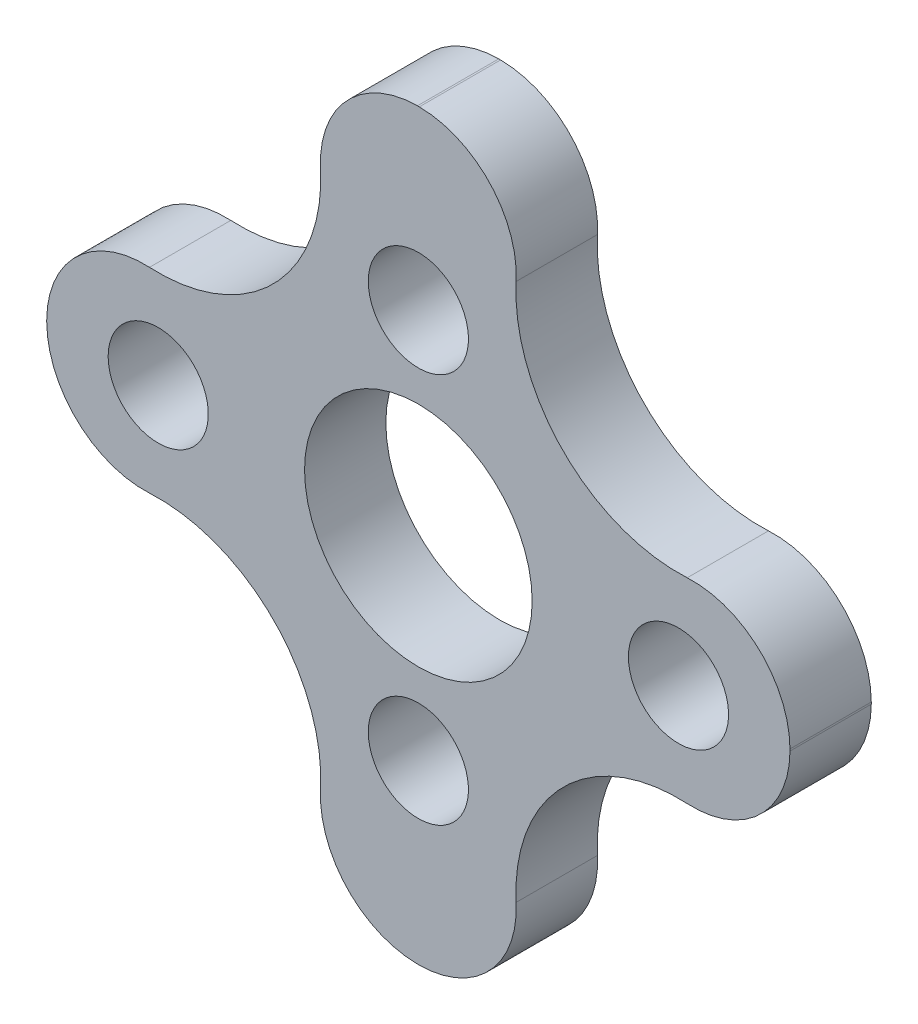
ISO-10303-21;
HEADER;
FILE_DESCRIPTION(('STEP AP214'),'2;1');
FILE_NAME('part.step','',(''),(''),'','','');
FILE_SCHEMA(('AUTOMOTIVE_DESIGN { 1 0 10303 214 1 1 1 1 }'));
ENDSEC;
DATA;
#1=APPLICATION_CONTEXT('core data for automotive mechanical design processes');
#2=APPLICATION_PROTOCOL_DEFINITION('international standard','automotive_design',2000,#1);
#3=PRODUCT_CONTEXT('',#1,'mechanical');
#4=PRODUCT('Part','Part','',(#3));
#5=PRODUCT_RELATED_PRODUCT_CATEGORY('part','',(#4));
#6=PRODUCT_DEFINITION_FORMATION('','',#4);
#7=PRODUCT_DEFINITION_CONTEXT('part definition',#1,'design');
#8=PRODUCT_DEFINITION('design','',#6,#7);
#9=PRODUCT_DEFINITION_SHAPE('','',#8);
#10=(LENGTH_UNIT() NAMED_UNIT(*) SI_UNIT(.MILLI.,.METRE.));
#11=(NAMED_UNIT(*) PLANE_ANGLE_UNIT() SI_UNIT($,.RADIAN.));
#12=(NAMED_UNIT(*) SI_UNIT($,.STERADIAN.) SOLID_ANGLE_UNIT());
#13=UNCERTAINTY_MEASURE_WITH_UNIT(LENGTH_MEASURE(1.E-05),#10,'distance_accuracy_value','');
#14=(GEOMETRIC_REPRESENTATION_CONTEXT(3) GLOBAL_UNCERTAINTY_ASSIGNED_CONTEXT((#13)) GLOBAL_UNIT_ASSIGNED_CONTEXT((#10,
#11,#12)) REPRESENTATION_CONTEXT('',''));
#15=CARTESIAN_POINT('',(0.,0.,0.));
#16=DIRECTION('',(0.,0.,1.));
#17=DIRECTION('',(1.,0.,0.));
#18=AXIS2_PLACEMENT_3D('',#15,#16,#17);
#19=CARTESIAN_POINT('',(8.42889909415681,0.0115054254860081,2.5));
#20=DIRECTION('',(0.,0.,1.));
#21=DIRECTION('',(1.,0.,0.));
#22=AXIS2_PLACEMENT_3D('',#19,#20,#21);
#23=CYLINDRICAL_SURFACE('',#22,3.);
#24=DIRECTION('',(0.,0.,-1.));
#25=VECTOR('',#24,1.);
#26=CARTESIAN_POINT('',(8.26806193384802,3.00719089092857,2.5));
#27=LINE('',#26,#25);
#28=CARTESIAN_POINT('',(8.26806193384801,3.00719089092857,2.5));
#29=VERTEX_POINT('',#28);
#30=CARTESIAN_POINT('',(8.26806193384801,3.00719089092857,0.));
#31=VERTEX_POINT('',#30);
#32=EDGE_CURVE('E272',#29,#31,#27,.T.);
#33=ORIENTED_EDGE('',*,*,#32,.F.);
#34=CARTESIAN_POINT('',(8.42889909415681,0.0115054254860081,2.5));
#35=DIRECTION('',(0.,0.,-1.));
#36=DIRECTION('',(-1.,0.,0.));
#37=AXIS2_PLACEMENT_3D('',#34,#35,#36);
#38=CIRCLE('',#37,3.);
#39=CARTESIAN_POINT('',(11.4288494531903,0.0287635637148508,2.5));
#40=VERTEX_POINT('',#39);
#41=EDGE_CURVE('E46',#40,#29,#38,.F.);
#42=ORIENTED_EDGE('',*,*,#41,.F.);
#43=DIRECTION('',(0.,0.,1.));
#44=VECTOR('',#43,1.);
#45=CARTESIAN_POINT('',(11.4288494531903,0.0287635637148472,2.5));
#46=LINE('',#45,#44);
#47=CARTESIAN_POINT('',(11.4288494531903,0.0287635637148508,0.));
#48=VERTEX_POINT('',#47);
#49=EDGE_CURVE('E276',#48,#40,#46,.T.);
#50=ORIENTED_EDGE('',*,*,#49,.F.);
#51=CARTESIAN_POINT('',(8.42889909415681,0.0115054254860081,0.));
#52=DIRECTION('',(0.,0.,-1.));
#53=DIRECTION('',(-1.,0.,0.));
#54=AXIS2_PLACEMENT_3D('',#51,#52,#53);
#55=CIRCLE('',#54,3.);
#56=EDGE_CURVE('E11',#31,#48,#55,.T.);
#57=ORIENTED_EDGE('',*,*,#56,.F.);
#58=EDGE_LOOP('',(#33,#42,#50,#57));
#59=FACE_BOUND('',#58,.T.);
#60=ADVANCED_FACE('F38',(#59),#23,.T.);
#61=CARTESIAN_POINT('',(8.42889909415681,-0.0115054254865624,2.5));
#62=DIRECTION('',(0.,0.,1.));
#63=DIRECTION('',(1.,0.,0.));
#64=AXIS2_PLACEMENT_3D('',#61,#62,#63);
#65=CYLINDRICAL_SURFACE('',#64,3.);
#66=DIRECTION('',(0.,0.,1.));
#67=VECTOR('',#66,1.);
#68=CARTESIAN_POINT('',(11.4288494531902,-0.028763563716579,2.5));
#69=LINE('',#68,#67);
#70=CARTESIAN_POINT('',(11.4288494531902,-0.0287635637165706,2.5));
#71=VERTEX_POINT('',#70);
#72=CARTESIAN_POINT('',(11.4288494531902,-0.0287635637165773,0.));
#73=VERTEX_POINT('',#72);
#74=EDGE_CURVE('E260',#71,#73,#69,.F.);
#75=ORIENTED_EDGE('',*,*,#74,.F.);
#76=CARTESIAN_POINT('',(8.42889909415681,-0.0115054254865624,2.5));
#77=DIRECTION('',(0.,0.,-1.));
#78=DIRECTION('',(-1.,0.,0.));
#79=AXIS2_PLACEMENT_3D('',#76,#77,#78);
#80=CIRCLE('',#79,3.);
#81=CARTESIAN_POINT('',(8.26806193384793,-3.00719089092912,2.5));
#82=VERTEX_POINT('',#81);
#83=EDGE_CURVE('E267',#82,#71,#80,.F.);
#84=ORIENTED_EDGE('',*,*,#83,.F.);
#85=DIRECTION('',(0.,0.,-1.));
#86=VECTOR('',#85,1.);
#87=CARTESIAN_POINT('',(8.26806193384792,-3.00719089092911,2.5));
#88=LINE('',#87,#86);
#89=CARTESIAN_POINT('',(8.26806193384793,-3.00719089092912,0.));
#90=VERTEX_POINT('',#89);
#91=EDGE_CURVE('E264',#90,#82,#88,.F.);
#92=ORIENTED_EDGE('',*,*,#91,.F.);
#93=CARTESIAN_POINT('',(8.42889909415681,-0.0115054254865624,0.));
#94=DIRECTION('',(0.,0.,-1.));
#95=DIRECTION('',(-1.,0.,0.));
#96=AXIS2_PLACEMENT_3D('',#93,#94,#95);
#97=CIRCLE('',#96,3.);
#98=EDGE_CURVE('E175',#73,#90,#97,.T.);
#99=ORIENTED_EDGE('',*,*,#98,.F.);
#100=EDGE_LOOP('',(#75,#84,#92,#99));
#101=FACE_BOUND('',#100,.T.);
#102=ADVANCED_FACE('F419',(#101),#65,.T.);
#103=CARTESIAN_POINT('',(-8.42889909415682,0.011505425486511,2.5));
#104=DIRECTION('',(0.,0.,-1.));
#105=DIRECTION('',(-1.,0.,0.));
#106=AXIS2_PLACEMENT_3D('',#103,#104,#105);
#107=CYLINDRICAL_SURFACE('',#106,3.);
#108=DIRECTION('',(0.,0.,-1.));
#109=VECTOR('',#108,1.);
#110=CARTESIAN_POINT('',(-8.26806193384802,3.00719089092907,2.5));
#111=LINE('',#110,#109);
#112=CARTESIAN_POINT('',(-8.26806193384802,3.00719089092907,0.));
#113=VERTEX_POINT('',#112);
#114=CARTESIAN_POINT('',(-8.26806193384802,3.00719089092907,2.5));
#115=VERTEX_POINT('',#114);
#116=EDGE_CURVE('E246',#113,#115,#111,.F.);
#117=ORIENTED_EDGE('',*,*,#116,.F.);
#118=CARTESIAN_POINT('',(-8.42889909415682,0.011505425486511,0.));
#119=DIRECTION('',(0.,0.,-1.));
#120=DIRECTION('',(-1.,0.,0.));
#121=AXIS2_PLACEMENT_3D('',#118,#119,#120);
#122=CIRCLE('',#121,3.);
#123=CARTESIAN_POINT('',(-11.4288494531903,0.0287635637162861,0.));
#124=VERTEX_POINT('',#123);
#125=EDGE_CURVE('E254',#124,#113,#122,.T.);
#126=ORIENTED_EDGE('',*,*,#125,.F.);
#127=DIRECTION('',(0.,0.,-1.));
#128=VECTOR('',#127,1.);
#129=CARTESIAN_POINT('',(-11.4288494531903,0.0287635637162854,2.5));
#130=LINE('',#129,#128);
#131=CARTESIAN_POINT('',(-11.4288494531903,0.0287635637099313,2.5));
#132=VERTEX_POINT('',#131);
#133=EDGE_CURVE('E250',#132,#124,#130,.T.);
#134=ORIENTED_EDGE('',*,*,#133,.F.);
#135=CARTESIAN_POINT('',(-8.42889909415682,0.011505425486511,2.5));
#136=DIRECTION('',(0.,0.,-1.));
#137=DIRECTION('',(-1.,0.,0.));
#138=AXIS2_PLACEMENT_3D('',#135,#136,#137);
#139=CIRCLE('',#138,3.);
#140=EDGE_CURVE('E257',#115,#132,#139,.F.);
#141=ORIENTED_EDGE('',*,*,#140,.F.);
#142=EDGE_LOOP('',(#117,#126,#134,#141));
#143=FACE_BOUND('',#142,.T.);
#144=ADVANCED_FACE('F406',(#143),#107,.T.);
#145=CARTESIAN_POINT('',(-0.0115054254865123,8.42889909415687,2.5));
#146=DIRECTION('',(0.,0.,1.));
#147=DIRECTION('',(1.,0.,0.));
#148=AXIS2_PLACEMENT_3D('',#145,#146,#147);
#149=CYLINDRICAL_SURFACE('',#148,3.);
#150=DIRECTION('',(0.,0.,-1.));
#151=VECTOR('',#150,1.);
#152=CARTESIAN_POINT('',(-3.00719089092907,8.26806193384804,2.5));
#153=LINE('',#152,#151);
#154=CARTESIAN_POINT('',(-3.00719089092907,8.26806193384804,2.5));
#155=VERTEX_POINT('',#154);
#156=CARTESIAN_POINT('',(-3.00719089092907,8.26806193384804,0.));
#157=VERTEX_POINT('',#156);
#158=EDGE_CURVE('E232',#155,#157,#153,.T.);
#159=ORIENTED_EDGE('',*,*,#158,.F.);
#160=CARTESIAN_POINT('',(-0.0115054254865123,8.42889909415687,2.5));
#161=DIRECTION('',(0.,0.,-1.));
#162=DIRECTION('',(-1.,0.,0.));
#163=AXIS2_PLACEMENT_3D('',#160,#161,#162);
#164=CIRCLE('',#163,3.);
#165=CARTESIAN_POINT('',(-0.0287635637163597,11.4288494531903,2.5));
#166=VERTEX_POINT('',#165);
#167=EDGE_CURVE('E240',#166,#155,#164,.F.);
#168=ORIENTED_EDGE('',*,*,#167,.F.);
#169=DIRECTION('',(0.,0.,1.));
#170=VECTOR('',#169,1.);
#171=CARTESIAN_POINT('',(-0.02876356371636,11.4288494531903,2.5));
#172=LINE('',#171,#170);
#173=CARTESIAN_POINT('',(-0.0287635637163597,11.4288494531903,0.));
#174=VERTEX_POINT('',#173);
#175=EDGE_CURVE('E236',#174,#166,#172,.T.);
#176=ORIENTED_EDGE('',*,*,#175,.F.);
#177=CARTESIAN_POINT('',(-0.0115054254865123,8.42889909415687,0.));
#178=DIRECTION('',(0.,0.,-1.));
#179=DIRECTION('',(-1.,0.,0.));
#180=AXIS2_PLACEMENT_3D('',#177,#178,#179);
#181=CIRCLE('',#180,3.);
#182=EDGE_CURVE('E243',#157,#174,#181,.T.);
#183=ORIENTED_EDGE('',*,*,#182,.F.);
#184=EDGE_LOOP('',(#159,#168,#176,#183));
#185=FACE_BOUND('',#184,.T.);
#186=ADVANCED_FACE('F369',(#185),#149,.T.);
#187=CARTESIAN_POINT('',(0.0115054254862531,8.42889909415687,2.5));
#188=DIRECTION('',(0.,0.,1.));
#189=DIRECTION('',(1.,0.,0.));
#190=AXIS2_PLACEMENT_3D('',#187,#188,#189);
#191=CYLINDRICAL_SURFACE('',#190,3.);
#192=DIRECTION('',(0.,0.,1.));
#193=VECTOR('',#192,1.);
#194=CARTESIAN_POINT('',(0.0287635637155534,11.4288494531903,2.5));
#195=LINE('',#194,#193);
#196=CARTESIAN_POINT('',(0.028763563715549,11.4288494531903,2.5));
#197=VERTEX_POINT('',#196);
#198=CARTESIAN_POINT('',(0.028763563715549,11.4288494531903,0.));
#199=VERTEX_POINT('',#198);
#200=EDGE_CURVE('E217',#197,#199,#195,.F.);
#201=ORIENTED_EDGE('',*,*,#200,.F.);
#202=CARTESIAN_POINT('',(0.0115054254862531,8.42889909415687,2.5));
#203=DIRECTION('',(0.,0.,-1.));
#204=DIRECTION('',(-1.,0.,0.));
#205=AXIS2_PLACEMENT_3D('',#202,#203,#204);
#206=CIRCLE('',#205,3.);
#207=CARTESIAN_POINT('',(3.00719089092881,8.26806193384797,2.5));
#208=VERTEX_POINT('',#207);
#209=EDGE_CURVE('E225',#208,#197,#206,.F.);
#210=ORIENTED_EDGE('',*,*,#209,.F.);
#211=DIRECTION('',(0.,0.,-1.));
#212=VECTOR('',#211,1.);
#213=CARTESIAN_POINT('',(3.00719089092881,8.26806193384796,2.5));
#214=LINE('',#213,#212);
#215=CARTESIAN_POINT('',(3.00719089092881,8.26806193384797,0.));
#216=VERTEX_POINT('',#215);
#217=EDGE_CURVE('E221',#216,#208,#214,.F.);
#218=ORIENTED_EDGE('',*,*,#217,.F.);
#219=CARTESIAN_POINT('',(0.0115054254862531,8.42889909415687,0.));
#220=DIRECTION('',(0.,0.,-1.));
#221=DIRECTION('',(-1.,0.,0.));
#222=AXIS2_PLACEMENT_3D('',#219,#220,#221);
#223=CIRCLE('',#222,3.);
#224=EDGE_CURVE('E228',#199,#216,#223,.T.);
#225=ORIENTED_EDGE('',*,*,#224,.F.);
#226=EDGE_LOOP('',(#201,#210,#218,#225));
#227=FACE_BOUND('',#226,.T.);
#228=ADVANCED_FACE('F409',(#227),#191,.T.);
#229=CARTESIAN_POINT('',(-8.42889909415682,-0.0115054254865408,2.5));
#230=DIRECTION('',(0.,0.,1.));
#231=DIRECTION('',(1.,0.,0.));
#232=AXIS2_PLACEMENT_3D('',#229,#230,#231);
#233=CYLINDRICAL_SURFACE('',#232,3.);
#234=DIRECTION('',(0.,0.,-1.));
#235=VECTOR('',#234,1.);
#236=CARTESIAN_POINT('',(-8.26806193384801,-3.0071908909291,2.5));
#237=LINE('',#236,#235);
#238=CARTESIAN_POINT('',(-8.268061933848,-3.0071908909291,2.5));
#239=VERTEX_POINT('',#238);
#240=CARTESIAN_POINT('',(-8.268061933848,-3.0071908909291,0.));
#241=VERTEX_POINT('',#240);
#242=EDGE_CURVE('E203',#239,#241,#237,.T.);
#243=ORIENTED_EDGE('',*,*,#242,.F.);
#244=CARTESIAN_POINT('',(-8.42889909415682,-0.0115054254865408,2.5));
#245=DIRECTION('',(0.,0.,-1.));
#246=DIRECTION('',(-1.,0.,0.));
#247=AXIS2_PLACEMENT_3D('',#244,#245,#246);
#248=CIRCLE('',#247,3.);
#249=CARTESIAN_POINT('',(-11.4288494531903,-0.0287635637163422,2.5));
#250=VERTEX_POINT('',#249);
#251=EDGE_CURVE('E211',#250,#239,#248,.F.);
#252=ORIENTED_EDGE('',*,*,#251,.F.);
#253=DIRECTION('',(0.,0.,-1.));
#254=VECTOR('',#253,1.);
#255=CARTESIAN_POINT('',(-11.4288494531903,-0.0287635637163441,2.5));
#256=LINE('',#255,#254);
#257=CARTESIAN_POINT('',(-11.4288494531903,-0.0287635637163422,0.));
#258=VERTEX_POINT('',#257);
#259=EDGE_CURVE('E207',#258,#250,#256,.F.);
#260=ORIENTED_EDGE('',*,*,#259,.F.);
#261=CARTESIAN_POINT('',(-8.42889909415682,-0.0115054254865408,0.));
#262=DIRECTION('',(0.,0.,-1.));
#263=DIRECTION('',(-1.,0.,0.));
#264=AXIS2_PLACEMENT_3D('',#261,#262,#263);
#265=CIRCLE('',#264,3.);
#266=EDGE_CURVE('E214',#241,#258,#265,.T.);
#267=ORIENTED_EDGE('',*,*,#266,.F.);
#268=EDGE_LOOP('',(#243,#252,#260,#267));
#269=FACE_BOUND('',#268,.T.);
#270=ADVANCED_FACE('F400',(#269),#233,.T.);
#271=CARTESIAN_POINT('',(-0.0115054254864763,-8.42889909415676,2.5));
#272=DIRECTION('',(0.,0.,-1.));
#273=DIRECTION('',(-1.,0.,0.));
#274=AXIS2_PLACEMENT_3D('',#271,#272,#273);
#275=CYLINDRICAL_SURFACE('',#274,3.);
#276=DIRECTION('',(0.,0.,-1.));
#277=VECTOR('',#276,1.);
#278=CARTESIAN_POINT('',(-3.00719089092904,-8.26806193384798,2.5));
#279=LINE('',#278,#277);
#280=CARTESIAN_POINT('',(-3.00719089092904,-8.26806193384799,0.));
#281=VERTEX_POINT('',#280);
#282=CARTESIAN_POINT('',(-3.00719089092904,-8.26806193384799,2.5));
#283=VERTEX_POINT('',#282);
#284=EDGE_CURVE('E160',#281,#283,#279,.F.);
#285=ORIENTED_EDGE('',*,*,#284,.F.);
#286=CARTESIAN_POINT('',(-0.0115054254864763,-8.42889909415676,0.));
#287=DIRECTION('',(0.,0.,-1.));
#288=DIRECTION('',(-1.,0.,0.));
#289=AXIS2_PLACEMENT_3D('',#286,#287,#288);
#290=CIRCLE('',#289,3.);
#291=CARTESIAN_POINT('',(-0.0287635637160889,-11.4288494531902,0.));
#292=VERTEX_POINT('',#291);
#293=EDGE_CURVE('E196',#292,#281,#290,.T.);
#294=ORIENTED_EDGE('',*,*,#293,.F.);
#295=DIRECTION('',(0.,0.,1.));
#296=VECTOR('',#295,1.);
#297=CARTESIAN_POINT('',(-0.0287635637160868,-11.4288494531902,2.5));
#298=LINE('',#297,#296);
#299=CARTESIAN_POINT('',(-0.0287635637097385,-11.4288494531902,2.5));
#300=VERTEX_POINT('',#299);
#301=EDGE_CURVE('E192',#300,#292,#298,.F.);
#302=ORIENTED_EDGE('',*,*,#301,.F.);
#303=CARTESIAN_POINT('',(-0.0115054254864763,-8.42889909415676,2.5));
#304=DIRECTION('',(0.,0.,-1.));
#305=DIRECTION('',(-1.,0.,0.));
#306=AXIS2_PLACEMENT_3D('',#303,#304,#305);
#307=CIRCLE('',#306,3.);
#308=EDGE_CURVE('E200',#283,#300,#307,.F.);
#309=ORIENTED_EDGE('',*,*,#308,.F.);
#310=EDGE_LOOP('',(#285,#294,#302,#309));
#311=FACE_BOUND('',#310,.T.);
#312=ADVANCED_FACE('F394',(#311),#275,.T.);
#313=CARTESIAN_POINT('',(0.0115054254860793,-8.42889909415676,2.5));
#314=DIRECTION('',(0.,0.,1.));
#315=DIRECTION('',(1.,0.,0.));
#316=AXIS2_PLACEMENT_3D('',#313,#314,#315);
#317=CYLINDRICAL_SURFACE('',#316,3.);
#318=DIRECTION('',(0.,0.,-1.));
#319=VECTOR('',#318,1.);
#320=CARTESIAN_POINT('',(3.00719089092864,-8.26806193384807,2.5));
#321=LINE('',#320,#319);
#322=CARTESIAN_POINT('',(3.00719089092864,-8.26806193384806,2.5));
#323=VERTEX_POINT('',#322);
#324=CARTESIAN_POINT('',(3.00719089092864,-8.26806193384806,0.));
#325=VERTEX_POINT('',#324);
#326=EDGE_CURVE('E152',#323,#325,#321,.T.);
#327=ORIENTED_EDGE('',*,*,#326,.F.);
#328=CARTESIAN_POINT('',(0.0115054254860793,-8.42889909415676,2.5));
#329=DIRECTION('',(0.,0.,-1.));
#330=DIRECTION('',(-1.,0.,0.));
#331=AXIS2_PLACEMENT_3D('',#328,#329,#330);
#332=CIRCLE('',#331,3.);
#333=CARTESIAN_POINT('',(0.0287635637153036,-11.4288494531902,2.5));
#334=VERTEX_POINT('',#333);
#335=EDGE_CURVE('E161',#334,#323,#332,.F.);
#336=ORIENTED_EDGE('',*,*,#335,.F.);
#337=DIRECTION('',(0.,0.,1.));
#338=VECTOR('',#337,1.);
#339=CARTESIAN_POINT('',(0.0287635637153023,-11.4288494531902,2.5));
#340=LINE('',#339,#338);
#341=CARTESIAN_POINT('',(0.0287635637153036,-11.4288494531902,0.));
#342=VERTEX_POINT('',#341);
#343=EDGE_CURVE('E155',#342,#334,#340,.T.);
#344=ORIENTED_EDGE('',*,*,#343,.F.);
#345=CARTESIAN_POINT('',(0.0115054254860793,-8.42889909415676,0.));
#346=DIRECTION('',(0.,0.,-1.));
#347=DIRECTION('',(-1.,0.,0.));
#348=AXIS2_PLACEMENT_3D('',#345,#346,#347);
#349=CIRCLE('',#348,3.);
#350=EDGE_CURVE('E148',#325,#342,#349,.T.);
#351=ORIENTED_EDGE('',*,*,#350,.F.);
#352=EDGE_LOOP('',(#327,#336,#344,#351));
#353=FACE_BOUND('',#352,.T.);
#354=ADVANCED_FACE('F150',(#353),#317,.T.);
#355=CARTESIAN_POINT('',(0.,6.42893218813458,2.5));
#356=DIRECTION('',(0.,0.,1.));
#357=DIRECTION('',(1.,0.,0.));
#358=AXIS2_PLACEMENT_3D('',#355,#356,#357);
#359=CYLINDRICAL_SURFACE('',#358,5.);
#360=CARTESIAN_POINT('',(0.,6.42893218813458,0.));
#361=DIRECTION('',(0.,0.,-1.));
#362=DIRECTION('',(-1.,0.,0.));
#363=AXIS2_PLACEMENT_3D('',#360,#361,#362);
#364=CIRCLE('',#363,5.);
#365=EDGE_CURVE('E356',#174,#199,#364,.T.);
#366=ORIENTED_EDGE('',*,*,#365,.F.);
#367=ORIENTED_EDGE('',*,*,#175,.T.);
#368=CARTESIAN_POINT('',(0.,6.42893218813458,2.5));
#369=DIRECTION('',(0.,0.,-1.));
#370=DIRECTION('',(-1.,0.,0.));
#371=AXIS2_PLACEMENT_3D('',#368,#369,#370);
#372=CIRCLE('',#371,5.);
#373=EDGE_CURVE('E181',#197,#166,#372,.F.);
#374=ORIENTED_EDGE('',*,*,#373,.F.);
#375=ORIENTED_EDGE('',*,*,#200,.T.);
#376=EDGE_LOOP('',(#366,#367,#374,#375));
#377=FACE_BOUND('',#376,.T.);
#378=ADVANCED_FACE('F366',(#377),#359,.T.);
#379=CARTESIAN_POINT('',(-6.42893218813453,0.,2.5));
#380=DIRECTION('',(0.,0.,-1.));
#381=DIRECTION('',(-1.,0.,0.));
#382=AXIS2_PLACEMENT_3D('',#379,#380,#381);
#383=CYLINDRICAL_SURFACE('',#382,5.);
#384=CARTESIAN_POINT('',(-6.42893218813453,0.,2.5));
#385=DIRECTION('',(0.,0.,-1.));
#386=DIRECTION('',(-1.,0.,0.));
#387=AXIS2_PLACEMENT_3D('',#384,#385,#386);
#388=CIRCLE('',#387,5.);
#389=EDGE_CURVE('E349',#132,#250,#388,.F.);
#390=ORIENTED_EDGE('',*,*,#389,.F.);
#391=ORIENTED_EDGE('',*,*,#133,.T.);
#392=CARTESIAN_POINT('',(-6.42893218813453,0.,0.));
#393=DIRECTION('',(0.,0.,-1.));
#394=DIRECTION('',(-1.,0.,0.));
#395=AXIS2_PLACEMENT_3D('',#392,#393,#394);
#396=CIRCLE('',#395,5.);
#397=EDGE_CURVE('E352',#258,#124,#396,.T.);
#398=ORIENTED_EDGE('',*,*,#397,.F.);
#399=ORIENTED_EDGE('',*,*,#259,.T.);
#400=EDGE_LOOP('',(#390,#391,#398,#399));
#401=FACE_BOUND('',#400,.T.);
#402=ADVANCED_FACE('F403',(#401),#383,.T.);
#403=CARTESIAN_POINT('',(0.,-6.42893218813447,2.5));
#404=DIRECTION('',(0.,0.,1.));
#405=DIRECTION('',(1.,0.,0.));
#406=AXIS2_PLACEMENT_3D('',#403,#404,#405);
#407=CYLINDRICAL_SURFACE('',#406,5.);
#408=CARTESIAN_POINT('',(0.,-6.42893218813447,2.5));
#409=DIRECTION('',(0.,0.,-1.));
#410=DIRECTION('',(-1.,0.,0.));
#411=AXIS2_PLACEMENT_3D('',#408,#409,#410);
#412=CIRCLE('',#411,5.);
#413=EDGE_CURVE('E346',#300,#334,#412,.F.);
#414=ORIENTED_EDGE('',*,*,#413,.F.);
#415=ORIENTED_EDGE('',*,*,#301,.T.);
#416=CARTESIAN_POINT('',(0.,-6.42893218813447,0.));
#417=DIRECTION('',(0.,0.,-1.));
#418=DIRECTION('',(-1.,0.,0.));
#419=AXIS2_PLACEMENT_3D('',#416,#417,#418);
#420=CIRCLE('',#419,5.);
#421=EDGE_CURVE('E343',#342,#292,#420,.T.);
#422=ORIENTED_EDGE('',*,*,#421,.F.);
#423=ORIENTED_EDGE('',*,*,#343,.T.);
#424=EDGE_LOOP('',(#414,#415,#422,#423));
#425=FACE_BOUND('',#424,.T.);
#426=ADVANCED_FACE('F434',(#425),#407,.T.);
#427=CARTESIAN_POINT('',(6.42893218813452,1.15359111152458E-13,2.5));
#428=DIRECTION('',(0.,0.,1.));
#429=DIRECTION('',(1.,0.,0.));
#430=AXIS2_PLACEMENT_3D('',#427,#428,#429);
#431=CYLINDRICAL_SURFACE('',#430,5.);
#432=CARTESIAN_POINT('',(6.42893218813452,1.15359111152458E-13,0.));
#433=DIRECTION('',(0.,0.,-1.));
#434=DIRECTION('',(-1.,0.,0.));
#435=AXIS2_PLACEMENT_3D('',#432,#433,#434);
#436=CIRCLE('',#435,5.);
#437=EDGE_CURVE('E335',#48,#73,#436,.T.);
#438=ORIENTED_EDGE('',*,*,#437,.F.);
#439=ORIENTED_EDGE('',*,*,#49,.T.);
#440=CARTESIAN_POINT('',(6.42893218813452,1.15359111152458E-13,2.5));
#441=DIRECTION('',(0.,0.,-1.));
#442=DIRECTION('',(-1.,0.,0.));
#443=AXIS2_PLACEMENT_3D('',#440,#441,#442);
#444=CIRCLE('',#443,5.);
#445=EDGE_CURVE('E286',#71,#40,#444,.F.);
#446=ORIENTED_EDGE('',*,*,#445,.F.);
#447=ORIENTED_EDGE('',*,*,#74,.T.);
#448=EDGE_LOOP('',(#438,#439,#446,#447));
#449=FACE_BOUND('',#448,.T.);
#450=ADVANCED_FACE('F432',(#449),#431,.T.);
#451=CARTESIAN_POINT('',(0.,0.,2.5));
#452=DIRECTION('',(0.,0.,-1.));
#453=DIRECTION('',(-1.,0.,0.));
#454=AXIS2_PLACEMENT_3D('',#451,#452,#453);
#455=PLANE('',#454);
#456=CARTESIAN_POINT('',(8.,0.,2.5));
#457=DIRECTION('',(0.,0.,-1.));
#458=DIRECTION('',(-1.,0.,0.));
#459=AXIS2_PLACEMENT_3D('',#456,#457,#458);
#460=CIRCLE('',#459,1.54);
#461=CARTESIAN_POINT('',(6.46,0.,2.5));
#462=VERTEX_POINT('',#461);
#463=EDGE_CURVE('E306',#462,#462,#460,.T.);
#464=ORIENTED_EDGE('',*,*,#463,.T.);
#465=EDGE_LOOP('',(#464));
#466=FACE_BOUND('',#465,.T.);
#467=CARTESIAN_POINT('',(-8.,0.,2.5));
#468=DIRECTION('',(0.,0.,-1.));
#469=DIRECTION('',(-1.,0.,0.));
#470=AXIS2_PLACEMENT_3D('',#467,#468,#469);
#471=CIRCLE('',#470,1.54);
#472=CARTESIAN_POINT('',(-9.54,0.,2.5));
#473=VERTEX_POINT('',#472);
#474=EDGE_CURVE('E297',#473,#473,#471,.T.);
#475=ORIENTED_EDGE('',*,*,#474,.T.);
#476=EDGE_LOOP('',(#475));
#477=FACE_BOUND('',#476,.T.);
#478=CARTESIAN_POINT('',(0.,6.,2.5));
#479=DIRECTION('',(0.,0.,-1.));
#480=DIRECTION('',(-1.,0.,0.));
#481=AXIS2_PLACEMENT_3D('',#478,#479,#480);
#482=CIRCLE('',#481,1.54);
#483=CARTESIAN_POINT('',(-1.54,6.,2.5));
#484=VERTEX_POINT('',#483);
#485=EDGE_CURVE('E324',#484,#484,#482,.T.);
#486=ORIENTED_EDGE('',*,*,#485,.T.);
#487=EDGE_LOOP('',(#486));
#488=FACE_BOUND('',#487,.T.);
#489=CARTESIAN_POINT('',(0.,-6.,2.5));
#490=DIRECTION('',(0.,0.,-1.));
#491=DIRECTION('',(-1.,0.,0.));
#492=AXIS2_PLACEMENT_3D('',#489,#490,#491);
#493=CIRCLE('',#492,1.54);
#494=CARTESIAN_POINT('',(-1.54,-6.,2.5));
#495=VERTEX_POINT('',#494);
#496=EDGE_CURVE('E315',#495,#495,#493,.T.);
#497=ORIENTED_EDGE('',*,*,#496,.T.);
#498=EDGE_LOOP('',(#497));
#499=FACE_BOUND('',#498,.T.);
#500=CARTESIAN_POINT('',(0.,0.,2.5));
#501=DIRECTION('',(0.,0.,-1.));
#502=DIRECTION('',(-1.,0.,0.));
#503=AXIS2_PLACEMENT_3D('',#500,#501,#502);
#504=CIRCLE('',#503,3.5);
#505=CARTESIAN_POINT('',(-3.5,0.,2.5));
#506=VERTEX_POINT('',#505);
#507=EDGE_CURVE('E331',#506,#506,#504,.T.);
#508=ORIENTED_EDGE('',*,*,#507,.T.);
#509=EDGE_LOOP('',(#508));
#510=FACE_BOUND('',#509,.T.);
#511=ORIENTED_EDGE('',*,*,#445,.T.);
#512=ORIENTED_EDGE('',*,*,#41,.T.);
#513=CARTESIAN_POINT('',(8.,7.99999999999977,2.5));
#514=DIRECTION('',(0.,0.,-1.));
#515=DIRECTION('',(-1.,0.,0.));
#516=AXIS2_PLACEMENT_3D('',#513,#514,#515);
#517=CIRCLE('',#516,5.00000000000027);
#518=EDGE_CURVE('E283',#29,#208,#517,.T.);
#519=ORIENTED_EDGE('',*,*,#518,.T.);
#520=ORIENTED_EDGE('',*,*,#209,.T.);
#521=ORIENTED_EDGE('',*,*,#373,.T.);
#522=ORIENTED_EDGE('',*,*,#167,.T.);
#523=CARTESIAN_POINT('',(-8.,8.,2.5));
#524=DIRECTION('',(0.,0.,-1.));
#525=DIRECTION('',(-1.,0.,0.));
#526=AXIS2_PLACEMENT_3D('',#523,#524,#525);
#527=CIRCLE('',#526,5.);
#528=EDGE_CURVE('E314',#155,#115,#527,.T.);
#529=ORIENTED_EDGE('',*,*,#528,.T.);
#530=ORIENTED_EDGE('',*,*,#140,.T.);
#531=ORIENTED_EDGE('',*,*,#389,.T.);
#532=ORIENTED_EDGE('',*,*,#251,.T.);
#533=CARTESIAN_POINT('',(-7.99999999999997,-8.00000000000003,2.5));
#534=DIRECTION('',(0.,0.,-1.));
#535=DIRECTION('',(-1.,0.,0.));
#536=AXIS2_PLACEMENT_3D('',#533,#534,#535);
#537=CIRCLE('',#536,5.);
#538=EDGE_CURVE('E380',#239,#283,#537,.T.);
#539=ORIENTED_EDGE('',*,*,#538,.T.);
#540=ORIENTED_EDGE('',*,*,#308,.T.);
#541=ORIENTED_EDGE('',*,*,#413,.T.);
#542=ORIENTED_EDGE('',*,*,#335,.T.);
#543=CARTESIAN_POINT('',(7.99999999999977,-8.00000000000023,2.5));
#544=DIRECTION('',(0.,0.,-1.));
#545=DIRECTION('',(-1.,0.,0.));
#546=AXIS2_PLACEMENT_3D('',#543,#544,#545);
#547=CIRCLE('',#546,5.00000000000019);
#548=EDGE_CURVE('E169',#323,#82,#547,.T.);
#549=ORIENTED_EDGE('',*,*,#548,.T.);
#550=ORIENTED_EDGE('',*,*,#83,.T.);
#551=EDGE_LOOP('',(#511,#512,#519,#520,#521,#522,#529,#530,#531,#532,#539,#540,#541,#542,#549,#550));
#552=FACE_BOUND('',#551,.T.);
#553=ADVANCED_FACE('F281',(#466,#477,#488,#499,#510,#552),#455,.F.);
#554=CARTESIAN_POINT('',(0.,0.,0.));
#555=DIRECTION('',(0.,0.,-1.));
#556=DIRECTION('',(-1.,0.,0.));
#557=AXIS2_PLACEMENT_3D('',#554,#555,#556);
#558=PLANE('',#557);
#559=CARTESIAN_POINT('',(8.,0.,0.));
#560=DIRECTION('',(0.,0.,-1.));
#561=DIRECTION('',(-1.,0.,0.));
#562=AXIS2_PLACEMENT_3D('',#559,#560,#561);
#563=CIRCLE('',#562,1.54);
#564=CARTESIAN_POINT('',(6.46,0.,0.));
#565=VERTEX_POINT('',#564);
#566=EDGE_CURVE('E310',#565,#565,#563,.T.);
#567=ORIENTED_EDGE('',*,*,#566,.F.);
#568=EDGE_LOOP('',(#567));
#569=FACE_BOUND('',#568,.T.);
#570=CARTESIAN_POINT('',(-8.,0.,0.));
#571=DIRECTION('',(0.,0.,-1.));
#572=DIRECTION('',(-1.,0.,0.));
#573=AXIS2_PLACEMENT_3D('',#570,#571,#572);
#574=CIRCLE('',#573,1.54);
#575=CARTESIAN_POINT('',(-9.54,0.,0.));
#576=VERTEX_POINT('',#575);
#577=EDGE_CURVE('E302',#576,#576,#574,.T.);
#578=ORIENTED_EDGE('',*,*,#577,.F.);
#579=EDGE_LOOP('',(#578));
#580=FACE_BOUND('',#579,.T.);
#581=CARTESIAN_POINT('',(0.,6.,0.));
#582=DIRECTION('',(0.,0.,-1.));
#583=DIRECTION('',(-1.,0.,0.));
#584=AXIS2_PLACEMENT_3D('',#581,#582,#583);
#585=CIRCLE('',#584,1.54);
#586=CARTESIAN_POINT('',(-1.54,6.,0.));
#587=VERTEX_POINT('',#586);
#588=EDGE_CURVE('E301',#587,#587,#585,.T.);
#589=ORIENTED_EDGE('',*,*,#588,.F.);
#590=EDGE_LOOP('',(#589));
#591=FACE_BOUND('',#590,.T.);
#592=CARTESIAN_POINT('',(0.,-6.,0.));
#593=DIRECTION('',(0.,0.,-1.));
#594=DIRECTION('',(-1.,0.,0.));
#595=AXIS2_PLACEMENT_3D('',#592,#593,#594);
#596=CIRCLE('',#595,1.54);
#597=CARTESIAN_POINT('',(-1.54,-6.,0.));
#598=VERTEX_POINT('',#597);
#599=EDGE_CURVE('E320',#598,#598,#596,.T.);
#600=ORIENTED_EDGE('',*,*,#599,.F.);
#601=EDGE_LOOP('',(#600));
#602=FACE_BOUND('',#601,.T.);
#603=CARTESIAN_POINT('',(8.,7.99999999999977,0.));
#604=DIRECTION('',(0.,0.,-1.));
#605=DIRECTION('',(-1.,0.,0.));
#606=AXIS2_PLACEMENT_3D('',#603,#604,#605);
#607=CIRCLE('',#606,5.00000000000027);
#608=EDGE_CURVE('E178',#31,#216,#607,.T.);
#609=ORIENTED_EDGE('',*,*,#608,.F.);
#610=ORIENTED_EDGE('',*,*,#56,.T.);
#611=ORIENTED_EDGE('',*,*,#437,.T.);
#612=ORIENTED_EDGE('',*,*,#98,.T.);
#613=CARTESIAN_POINT('',(7.99999999999977,-8.00000000000023,0.));
#614=DIRECTION('',(0.,0.,-1.));
#615=DIRECTION('',(-1.,0.,0.));
#616=AXIS2_PLACEMENT_3D('',#613,#614,#615);
#617=CIRCLE('',#616,5.00000000000019);
#618=EDGE_CURVE('E167',#325,#90,#617,.T.);
#619=ORIENTED_EDGE('',*,*,#618,.F.);
#620=ORIENTED_EDGE('',*,*,#350,.T.);
#621=ORIENTED_EDGE('',*,*,#421,.T.);
#622=ORIENTED_EDGE('',*,*,#293,.T.);
#623=CARTESIAN_POINT('',(-7.99999999999997,-8.00000000000003,0.));
#624=DIRECTION('',(0.,0.,-1.));
#625=DIRECTION('',(-1.,0.,0.));
#626=AXIS2_PLACEMENT_3D('',#623,#624,#625);
#627=CIRCLE('',#626,5.);
#628=EDGE_CURVE('E293',#241,#281,#627,.T.);
#629=ORIENTED_EDGE('',*,*,#628,.F.);
#630=ORIENTED_EDGE('',*,*,#266,.T.);
#631=ORIENTED_EDGE('',*,*,#397,.T.);
#632=ORIENTED_EDGE('',*,*,#125,.T.);
#633=CARTESIAN_POINT('',(-8.,8.,0.));
#634=DIRECTION('',(0.,0.,-1.));
#635=DIRECTION('',(-1.,0.,0.));
#636=AXIS2_PLACEMENT_3D('',#633,#634,#635);
#637=CIRCLE('',#636,5.);
#638=EDGE_CURVE('E377',#157,#113,#637,.T.);
#639=ORIENTED_EDGE('',*,*,#638,.F.);
#640=ORIENTED_EDGE('',*,*,#182,.T.);
#641=ORIENTED_EDGE('',*,*,#365,.T.);
#642=ORIENTED_EDGE('',*,*,#224,.T.);
#643=EDGE_LOOP('',(#609,#610,#611,#612,#619,#620,#621,#622,#629,#630,#631,#632,#639,#640,#641,#642));
#644=FACE_BOUND('',#643,.T.);
#645=CARTESIAN_POINT('',(0.,0.,0.));
#646=DIRECTION('',(0.,0.,-1.));
#647=DIRECTION('',(-1.,0.,0.));
#648=AXIS2_PLACEMENT_3D('',#645,#646,#647);
#649=CIRCLE('',#648,3.5);
#650=CARTESIAN_POINT('',(-3.5,0.,0.));
#651=VERTEX_POINT('',#650);
#652=EDGE_CURVE('E319',#651,#651,#649,.T.);
#653=ORIENTED_EDGE('',*,*,#652,.F.);
#654=EDGE_LOOP('',(#653));
#655=FACE_BOUND('',#654,.T.);
#656=ADVANCED_FACE('F172',(#569,#580,#591,#602,#644,#655),#558,.T.);
#657=CARTESIAN_POINT('',(0.,0.,2.5));
#658=DIRECTION('',(0.,0.,-1.));
#659=DIRECTION('',(-1.,0.,0.));
#660=AXIS2_PLACEMENT_3D('',#657,#658,#659);
#661=CYLINDRICAL_SURFACE('',#660,3.5);
#662=ORIENTED_EDGE('',*,*,#507,.F.);
#663=EDGE_LOOP('',(#662));
#664=FACE_BOUND('',#663,.T.);
#665=ORIENTED_EDGE('',*,*,#652,.T.);
#666=EDGE_LOOP('',(#665));
#667=FACE_BOUND('',#666,.T.);
#668=ADVANCED_FACE('F507',(#664,#667),#661,.F.);
#669=CARTESIAN_POINT('',(8.,7.99999999999977,2.5));
#670=DIRECTION('',(0.,0.,-1.));
#671=DIRECTION('',(-1.,0.,0.));
#672=AXIS2_PLACEMENT_3D('',#669,#670,#671);
#673=CYLINDRICAL_SURFACE('',#672,5.00000000000027);
#674=ORIENTED_EDGE('',*,*,#518,.F.);
#675=ORIENTED_EDGE('',*,*,#32,.T.);
#676=ORIENTED_EDGE('',*,*,#608,.T.);
#677=ORIENTED_EDGE('',*,*,#217,.T.);
#678=EDGE_LOOP('',(#674,#675,#676,#677));
#679=FACE_BOUND('',#678,.T.);
#680=ADVANCED_FACE('F288',(#679),#673,.F.);
#681=CARTESIAN_POINT('',(7.99999999999977,-8.00000000000023,2.5));
#682=DIRECTION('',(0.,0.,-1.));
#683=DIRECTION('',(-1.,0.,0.));
#684=AXIS2_PLACEMENT_3D('',#681,#682,#683);
#685=CYLINDRICAL_SURFACE('',#684,5.00000000000019);
#686=ORIENTED_EDGE('',*,*,#618,.T.);
#687=ORIENTED_EDGE('',*,*,#91,.T.);
#688=ORIENTED_EDGE('',*,*,#548,.F.);
#689=ORIENTED_EDGE('',*,*,#326,.T.);
#690=EDGE_LOOP('',(#686,#687,#688,#689));
#691=FACE_BOUND('',#690,.T.);
#692=ADVANCED_FACE('F165',(#691),#685,.F.);
#693=CARTESIAN_POINT('',(-7.99999999999997,-8.00000000000003,2.5));
#694=DIRECTION('',(0.,0.,-1.));
#695=DIRECTION('',(-1.,0.,0.));
#696=AXIS2_PLACEMENT_3D('',#693,#694,#695);
#697=CYLINDRICAL_SURFACE('',#696,5.);
#698=ORIENTED_EDGE('',*,*,#538,.F.);
#699=ORIENTED_EDGE('',*,*,#242,.T.);
#700=ORIENTED_EDGE('',*,*,#628,.T.);
#701=ORIENTED_EDGE('',*,*,#284,.T.);
#702=EDGE_LOOP('',(#698,#699,#700,#701));
#703=FACE_BOUND('',#702,.T.);
#704=ADVANCED_FACE('F388',(#703),#697,.F.);
#705=CARTESIAN_POINT('',(-8.,8.,2.5));
#706=DIRECTION('',(0.,0.,-1.));
#707=DIRECTION('',(-1.,0.,0.));
#708=AXIS2_PLACEMENT_3D('',#705,#706,#707);
#709=CYLINDRICAL_SURFACE('',#708,5.);
#710=ORIENTED_EDGE('',*,*,#638,.T.);
#711=ORIENTED_EDGE('',*,*,#116,.T.);
#712=ORIENTED_EDGE('',*,*,#528,.F.);
#713=ORIENTED_EDGE('',*,*,#158,.T.);
#714=EDGE_LOOP('',(#710,#711,#712,#713));
#715=FACE_BOUND('',#714,.T.);
#716=ADVANCED_FACE('F374',(#715),#709,.F.);
#717=CARTESIAN_POINT('',(0.,-6.,2.5));
#718=DIRECTION('',(0.,0.,-1.));
#719=DIRECTION('',(-1.,0.,0.));
#720=AXIS2_PLACEMENT_3D('',#717,#718,#719);
#721=CYLINDRICAL_SURFACE('',#720,1.54);
#722=ORIENTED_EDGE('',*,*,#496,.F.);
#723=EDGE_LOOP('',(#722));
#724=FACE_BOUND('',#723,.T.);
#725=ORIENTED_EDGE('',*,*,#599,.T.);
#726=EDGE_LOOP('',(#725));
#727=FACE_BOUND('',#726,.T.);
#728=ADVANCED_FACE('F490',(#724,#727),#721,.F.);
#729=CARTESIAN_POINT('',(0.,6.,2.5));
#730=DIRECTION('',(0.,0.,-1.));
#731=DIRECTION('',(-1.,0.,0.));
#732=AXIS2_PLACEMENT_3D('',#729,#730,#731);
#733=CYLINDRICAL_SURFACE('',#732,1.54);
#734=ORIENTED_EDGE('',*,*,#485,.F.);
#735=EDGE_LOOP('',(#734));
#736=FACE_BOUND('',#735,.T.);
#737=ORIENTED_EDGE('',*,*,#588,.T.);
#738=EDGE_LOOP('',(#737));
#739=FACE_BOUND('',#738,.T.);
#740=ADVANCED_FACE('F480',(#736,#739),#733,.F.);
#741=CARTESIAN_POINT('',(-8.,0.,2.5));
#742=DIRECTION('',(0.,0.,-1.));
#743=DIRECTION('',(-1.,0.,0.));
#744=AXIS2_PLACEMENT_3D('',#741,#742,#743);
#745=CYLINDRICAL_SURFACE('',#744,1.54);
#746=ORIENTED_EDGE('',*,*,#474,.F.);
#747=EDGE_LOOP('',(#746));
#748=FACE_BOUND('',#747,.T.);
#749=ORIENTED_EDGE('',*,*,#577,.T.);
#750=EDGE_LOOP('',(#749));
#751=FACE_BOUND('',#750,.T.);
#752=ADVANCED_FACE('F470',(#748,#751),#745,.F.);
#753=CARTESIAN_POINT('',(8.,0.,2.5));
#754=DIRECTION('',(0.,0.,-1.));
#755=DIRECTION('',(-1.,0.,0.));
#756=AXIS2_PLACEMENT_3D('',#753,#754,#755);
#757=CYLINDRICAL_SURFACE('',#756,1.54);
#758=ORIENTED_EDGE('',*,*,#463,.F.);
#759=EDGE_LOOP('',(#758));
#760=FACE_BOUND('',#759,.T.);
#761=ORIENTED_EDGE('',*,*,#566,.T.);
#762=EDGE_LOOP('',(#761));
#763=FACE_BOUND('',#762,.T.);
#764=ADVANCED_FACE('F467',(#760,#763),#757,.F.);
#765=CLOSED_SHELL('',(#60,#102,#144,#186,#228,#270,#312,#354,#378,#402,#426,#450,#553,#656,#668,
#680,#692,#704,#716,#728,#740,#752,#764));
#766=MANIFOLD_SOLID_BREP('B2',#765);
#767=ADVANCED_BREP_SHAPE_REPRESENTATION('',(#18,#766),#14);
#768=SHAPE_DEFINITION_REPRESENTATION(#9,#767);
ENDSEC;
END-ISO-10303-21;
